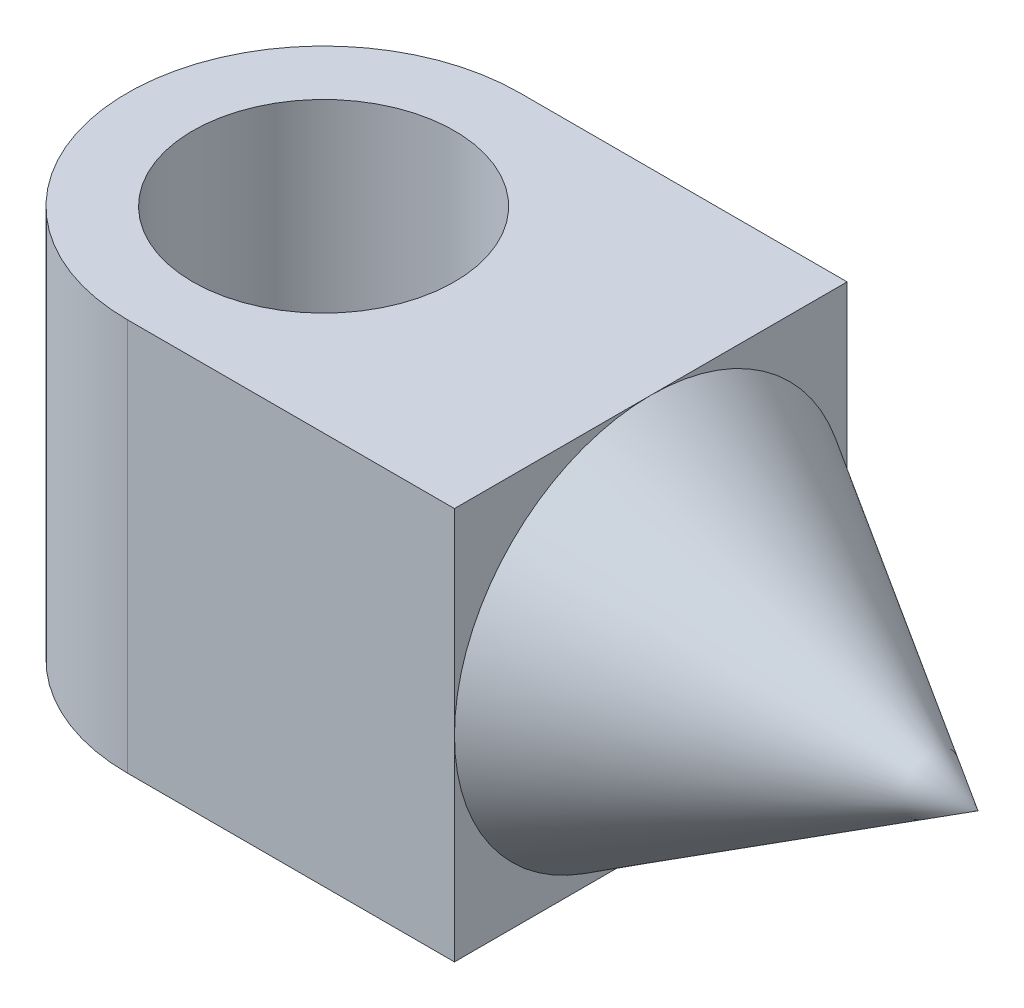
ISO-10303-21;
HEADER;
FILE_DESCRIPTION(('STEP AP214'),'2;1');
FILE_NAME('part.step','',(''),(''),'','','');
FILE_SCHEMA(('AUTOMOTIVE_DESIGN { 1 0 10303 214 1 1 1 1 }'));
ENDSEC;
DATA;
#1=APPLICATION_CONTEXT('core data for automotive mechanical design processes');
#2=APPLICATION_PROTOCOL_DEFINITION('international standard','automotive_design',2000,#1);
#3=PRODUCT_CONTEXT('',#1,'mechanical');
#4=PRODUCT('Part','Part','',(#3));
#5=PRODUCT_RELATED_PRODUCT_CATEGORY('part','',(#4));
#6=PRODUCT_DEFINITION_FORMATION('','',#4);
#7=PRODUCT_DEFINITION_CONTEXT('part definition',#1,'design');
#8=PRODUCT_DEFINITION('design','',#6,#7);
#9=PRODUCT_DEFINITION_SHAPE('','',#8);
#10=(LENGTH_UNIT() NAMED_UNIT(*) SI_UNIT(.MILLI.,.METRE.));
#11=(NAMED_UNIT(*) PLANE_ANGLE_UNIT() SI_UNIT($,.RADIAN.));
#12=(NAMED_UNIT(*) SI_UNIT($,.STERADIAN.) SOLID_ANGLE_UNIT());
#13=UNCERTAINTY_MEASURE_WITH_UNIT(LENGTH_MEASURE(1.E-05),#10,'distance_accuracy_value','');
#14=(GEOMETRIC_REPRESENTATION_CONTEXT(3) GLOBAL_UNCERTAINTY_ASSIGNED_CONTEXT((#13)) GLOBAL_UNIT_ASSIGNED_CONTEXT((#10,
#11,#12)) REPRESENTATION_CONTEXT('',''));
#15=CARTESIAN_POINT('',(0.,0.,0.));
#16=DIRECTION('',(0.,0.,1.));
#17=DIRECTION('',(1.,0.,0.));
#18=AXIS2_PLACEMENT_3D('',#15,#16,#17);
#19=CARTESIAN_POINT('',(0.,-15.,0.));
#20=DIRECTION('',(1.,0.,0.));
#21=DIRECTION('',(0.,0.,-1.));
#22=AXIS2_PLACEMENT_3D('',#19,#20,#21);
#23=PLANE('',#22);
#24=CARTESIAN_POINT('',(0.,0.,0.));
#25=DIRECTION('',(-1.,0.,0.));
#26=DIRECTION('',(0.,0.,1.));
#27=AXIS2_PLACEMENT_3D('',#24,#25,#26);
#28=CIRCLE('',#27,15.);
#29=CARTESIAN_POINT('',(0.,15.,0.));
#30=VERTEX_POINT('',#29);
#31=CARTESIAN_POINT('',(0.,0.,-15.));
#32=VERTEX_POINT('',#31);
#33=EDGE_CURVE('E106',#30,#32,#28,.T.);
#34=ORIENTED_EDGE('',*,*,#33,.T.);
#35=DIRECTION('',(0.,1.,0.));
#36=VECTOR('',#35,1.);
#37=CARTESIAN_POINT('',(0.,-15.,-15.));
#38=LINE('',#37,#36);
#39=CARTESIAN_POINT('',(0.,15.,-15.));
#40=VERTEX_POINT('',#39);
#41=EDGE_CURVE('E50',#32,#40,#38,.T.);
#42=ORIENTED_EDGE('',*,*,#41,.T.);
#43=DIRECTION('',(0.,0.,-1.));
#44=VECTOR('',#43,1.);
#45=CARTESIAN_POINT('',(0.,15.,0.));
#46=LINE('',#45,#44);
#47=EDGE_CURVE('E132',#30,#40,#46,.T.);
#48=ORIENTED_EDGE('',*,*,#47,.F.);
#49=EDGE_LOOP('',(#34,#42,#48));
#50=FACE_BOUND('',#49,.T.);
#51=ADVANCED_FACE('F40',(#50),#23,.T.);
#52=CARTESIAN_POINT('',(0.,0.,15.));
#53=VERTEX_POINT('',#52);
#54=EDGE_CURVE('E104',#53,#30,#28,.T.);
#55=ORIENTED_EDGE('',*,*,#54,.T.);
#56=CARTESIAN_POINT('',(0.,15.,15.));
#57=VERTEX_POINT('',#56);
#58=EDGE_CURVE('E133',#57,#30,#46,.T.);
#59=ORIENTED_EDGE('',*,*,#58,.F.);
#60=DIRECTION('',(0.,1.,0.));
#61=VECTOR('',#60,1.);
#62=CARTESIAN_POINT('',(0.,-15.,15.));
#63=LINE('',#62,#61);
#64=EDGE_CURVE('E160',#53,#57,#63,.T.);
#65=ORIENTED_EDGE('',*,*,#64,.F.);
#66=EDGE_LOOP('',(#55,#59,#65));
#67=FACE_BOUND('',#66,.T.);
#68=ADVANCED_FACE('F188',(#67),#23,.T.);
#69=CARTESIAN_POINT('',(0.,-15.,0.));
#70=VERTEX_POINT('',#69);
#71=EDGE_CURVE('E58',#70,#53,#28,.T.);
#72=ORIENTED_EDGE('',*,*,#71,.T.);
#73=CARTESIAN_POINT('',(0.,-15.,15.));
#74=VERTEX_POINT('',#73);
#75=EDGE_CURVE('E157',#74,#53,#63,.T.);
#76=ORIENTED_EDGE('',*,*,#75,.F.);
#77=DIRECTION('',(0.,0.,-1.));
#78=VECTOR('',#77,1.);
#79=CARTESIAN_POINT('',(0.,-15.,0.));
#80=LINE('',#79,#78);
#81=EDGE_CURVE('E154',#74,#70,#80,.T.);
#82=ORIENTED_EDGE('',*,*,#81,.T.);
#83=EDGE_LOOP('',(#72,#76,#82));
#84=FACE_BOUND('',#83,.T.);
#85=ADVANCED_FACE('F193',(#84),#23,.T.);
#86=CARTESIAN_POINT('',(0.,-15.,-15.));
#87=DIRECTION('',(0.,0.,1.));
#88=DIRECTION('',(1.,0.,0.));
#89=AXIS2_PLACEMENT_3D('',#86,#87,#88);
#90=PLANE('',#89);
#91=DIRECTION('',(0.,1.,0.));
#92=VECTOR('',#91,1.);
#93=CARTESIAN_POINT('',(-25.,-15.,-15.));
#94=LINE('',#93,#92);
#95=CARTESIAN_POINT('',(-25.,-15.,-15.));
#96=VERTEX_POINT('',#95);
#97=CARTESIAN_POINT('',(-25.,15.,-15.));
#98=VERTEX_POINT('',#97);
#99=EDGE_CURVE('E44',#96,#98,#94,.T.);
#100=ORIENTED_EDGE('',*,*,#99,.T.);
#101=DIRECTION('',(1.,0.,0.));
#102=VECTOR('',#101,1.);
#103=CARTESIAN_POINT('',(0.,15.,-15.));
#104=LINE('',#103,#102);
#105=EDGE_CURVE('E116',#98,#40,#104,.T.);
#106=ORIENTED_EDGE('',*,*,#105,.T.);
#107=ORIENTED_EDGE('',*,*,#41,.F.);
#108=CARTESIAN_POINT('',(0.,-15.,-15.));
#109=VERTEX_POINT('',#108);
#110=EDGE_CURVE('E11',#109,#32,#38,.T.);
#111=ORIENTED_EDGE('',*,*,#110,.F.);
#112=DIRECTION('',(1.,0.,0.));
#113=VECTOR('',#112,1.);
#114=CARTESIAN_POINT('',(0.,-15.,-15.));
#115=LINE('',#114,#113);
#116=EDGE_CURVE('E141',#96,#109,#115,.T.);
#117=ORIENTED_EDGE('',*,*,#116,.F.);
#118=EDGE_LOOP('',(#100,#106,#107,#111,#117));
#119=FACE_BOUND('',#118,.T.);
#120=ADVANCED_FACE('F170',(#119),#90,.F.);
#121=EDGE_CURVE('E65',#32,#70,#28,.T.);
#122=ORIENTED_EDGE('',*,*,#121,.T.);
#123=EDGE_CURVE('E153',#70,#109,#80,.T.);
#124=ORIENTED_EDGE('',*,*,#123,.T.);
#125=ORIENTED_EDGE('',*,*,#110,.T.);
#126=EDGE_LOOP('',(#122,#124,#125));
#127=FACE_BOUND('',#126,.T.);
#128=ADVANCED_FACE('F181',(#127),#23,.T.);
#129=CARTESIAN_POINT('',(0.,-15.,15.));
#130=DIRECTION('',(0.,0.,1.));
#131=DIRECTION('',(1.,0.,0.));
#132=AXIS2_PLACEMENT_3D('',#129,#130,#131);
#133=PLANE('',#132);
#134=ORIENTED_EDGE('',*,*,#75,.T.);
#135=ORIENTED_EDGE('',*,*,#64,.T.);
#136=DIRECTION('',(1.,0.,0.));
#137=VECTOR('',#136,1.);
#138=CARTESIAN_POINT('',(0.,15.,15.));
#139=LINE('',#138,#137);
#140=CARTESIAN_POINT('',(-25.,15.,15.));
#141=VERTEX_POINT('',#140);
#142=EDGE_CURVE('E128',#141,#57,#139,.T.);
#143=ORIENTED_EDGE('',*,*,#142,.F.);
#144=DIRECTION('',(0.,1.,0.));
#145=VECTOR('',#144,1.);
#146=CARTESIAN_POINT('',(-25.,-15.,15.));
#147=LINE('',#146,#145);
#148=CARTESIAN_POINT('',(-25.,-15.,15.));
#149=VERTEX_POINT('',#148);
#150=EDGE_CURVE('E161',#149,#141,#147,.T.);
#151=ORIENTED_EDGE('',*,*,#150,.F.);
#152=DIRECTION('',(1.,0.,0.));
#153=VECTOR('',#152,1.);
#154=CARTESIAN_POINT('',(0.,-15.,15.));
#155=LINE('',#154,#153);
#156=EDGE_CURVE('E149',#149,#74,#155,.T.);
#157=ORIENTED_EDGE('',*,*,#156,.T.);
#158=EDGE_LOOP('',(#134,#135,#143,#151,#157));
#159=FACE_BOUND('',#158,.T.);
#160=ADVANCED_FACE('F197',(#159),#133,.T.);
#161=CARTESIAN_POINT('',(-25.,-15.,0.));
#162=DIRECTION('',(0.,1.,0.));
#163=DIRECTION('',(0.,0.,1.));
#164=AXIS2_PLACEMENT_3D('',#161,#162,#163);
#165=CYLINDRICAL_SURFACE('',#164,10.);
#166=CARTESIAN_POINT('',(-25.,-15.,0.));
#167=DIRECTION('',(0.,1.,0.));
#168=DIRECTION('',(0.,0.,1.));
#169=AXIS2_PLACEMENT_3D('',#166,#167,#168);
#170=CIRCLE('',#169,10.);
#171=CARTESIAN_POINT('',(-25.,-15.,10.));
#172=VERTEX_POINT('',#171);
#173=EDGE_CURVE('E137',#172,#172,#170,.T.);
#174=ORIENTED_EDGE('',*,*,#173,.F.);
#175=EDGE_LOOP('',(#174));
#176=FACE_BOUND('',#175,.T.);
#177=CARTESIAN_POINT('',(-25.,15.,0.));
#178=DIRECTION('',(0.,1.,0.));
#179=DIRECTION('',(0.,0.,1.));
#180=AXIS2_PLACEMENT_3D('',#177,#178,#179);
#181=CIRCLE('',#180,10.);
#182=CARTESIAN_POINT('',(-25.,15.,10.));
#183=VERTEX_POINT('',#182);
#184=EDGE_CURVE('E111',#183,#183,#181,.T.);
#185=ORIENTED_EDGE('',*,*,#184,.T.);
#186=EDGE_LOOP('',(#185));
#187=FACE_BOUND('',#186,.T.);
#188=ADVANCED_FACE('F42',(#176,#187),#165,.F.);
#189=CARTESIAN_POINT('',(-25.,-15.,0.));
#190=DIRECTION('',(0.,1.,0.));
#191=DIRECTION('',(0.,0.,1.));
#192=AXIS2_PLACEMENT_3D('',#189,#190,#191);
#193=CYLINDRICAL_SURFACE('',#192,15.);
#194=ORIENTED_EDGE('',*,*,#150,.T.);
#195=CARTESIAN_POINT('',(-25.,15.,0.));
#196=DIRECTION('',(0.,1.,0.));
#197=DIRECTION('',(0.,0.,1.));
#198=AXIS2_PLACEMENT_3D('',#195,#196,#197);
#199=CIRCLE('',#198,15.);
#200=EDGE_CURVE('E124',#98,#141,#199,.T.);
#201=ORIENTED_EDGE('',*,*,#200,.F.);
#202=ORIENTED_EDGE('',*,*,#99,.F.);
#203=CARTESIAN_POINT('',(-25.,-15.,0.));
#204=DIRECTION('',(0.,1.,0.));
#205=DIRECTION('',(0.,0.,1.));
#206=AXIS2_PLACEMENT_3D('',#203,#204,#205);
#207=CIRCLE('',#206,15.);
#208=EDGE_CURVE('E145',#96,#149,#207,.T.);
#209=ORIENTED_EDGE('',*,*,#208,.T.);
#210=EDGE_LOOP('',(#194,#201,#202,#209));
#211=FACE_BOUND('',#210,.T.);
#212=ADVANCED_FACE('F175',(#211),#193,.T.);
#213=CARTESIAN_POINT('',(0.,-15.,0.));
#214=DIRECTION('',(0.,1.,0.));
#215=DIRECTION('',(0.,0.,1.));
#216=AXIS2_PLACEMENT_3D('',#213,#214,#215);
#217=PLANE('',#216);
#218=ORIENTED_EDGE('',*,*,#173,.T.);
#219=EDGE_LOOP('',(#218));
#220=FACE_BOUND('',#219,.T.);
#221=ORIENTED_EDGE('',*,*,#116,.T.);
#222=ORIENTED_EDGE('',*,*,#123,.F.);
#223=ORIENTED_EDGE('',*,*,#81,.F.);
#224=ORIENTED_EDGE('',*,*,#156,.F.);
#225=ORIENTED_EDGE('',*,*,#208,.F.);
#226=EDGE_LOOP('',(#221,#222,#223,#224,#225));
#227=FACE_BOUND('',#226,.T.);
#228=ADVANCED_FACE('F184',(#220,#227),#217,.F.);
#229=CARTESIAN_POINT('',(0.,15.,0.));
#230=DIRECTION('',(0.,1.,0.));
#231=DIRECTION('',(0.,0.,1.));
#232=AXIS2_PLACEMENT_3D('',#229,#230,#231);
#233=PLANE('',#232);
#234=ORIENTED_EDGE('',*,*,#184,.F.);
#235=EDGE_LOOP('',(#234));
#236=FACE_BOUND('',#235,.T.);
#237=ORIENTED_EDGE('',*,*,#105,.F.);
#238=ORIENTED_EDGE('',*,*,#200,.T.);
#239=ORIENTED_EDGE('',*,*,#142,.T.);
#240=ORIENTED_EDGE('',*,*,#58,.T.);
#241=ORIENTED_EDGE('',*,*,#47,.T.);
#242=EDGE_LOOP('',(#237,#238,#239,#240,#241));
#243=FACE_BOUND('',#242,.T.);
#244=ADVANCED_FACE('F100',(#236,#243),#233,.T.);
#245=CARTESIAN_POINT('',(0.,0.,0.));
#246=DIRECTION('',(-1.,0.,0.));
#247=DIRECTION('',(0.,0.,1.));
#248=AXIS2_PLACEMENT_3D('',#245,#246,#247);
#249=CONICAL_SURFACE('',#248,15.,0.540419500270584);
#250=CARTESIAN_POINT('',(25.,0.,0.));
#251=VERTEX_POINT('',#250);
#252=VERTEX_LOOP('',#251);
#253=FACE_BOUND('',#252,.T.);
#254=ORIENTED_EDGE('',*,*,#54,.F.);
#255=ORIENTED_EDGE('',*,*,#71,.F.);
#256=ORIENTED_EDGE('',*,*,#121,.F.);
#257=ORIENTED_EDGE('',*,*,#33,.F.);
#258=EDGE_LOOP('',(#254,#255,#256,#257));
#259=FACE_BOUND('',#258,.T.);
#260=ADVANCED_FACE('F97',(#253,#259),#249,.T.);
#261=CLOSED_SHELL('',(#51,#68,#85,#120,#128,#160,#188,#212,#228,#244,#260));
#262=MANIFOLD_SOLID_BREP('B2',#261);
#263=ADVANCED_BREP_SHAPE_REPRESENTATION('',(#18,#262),#14);
#264=SHAPE_DEFINITION_REPRESENTATION(#9,#263);
ENDSEC;
END-ISO-10303-21;
